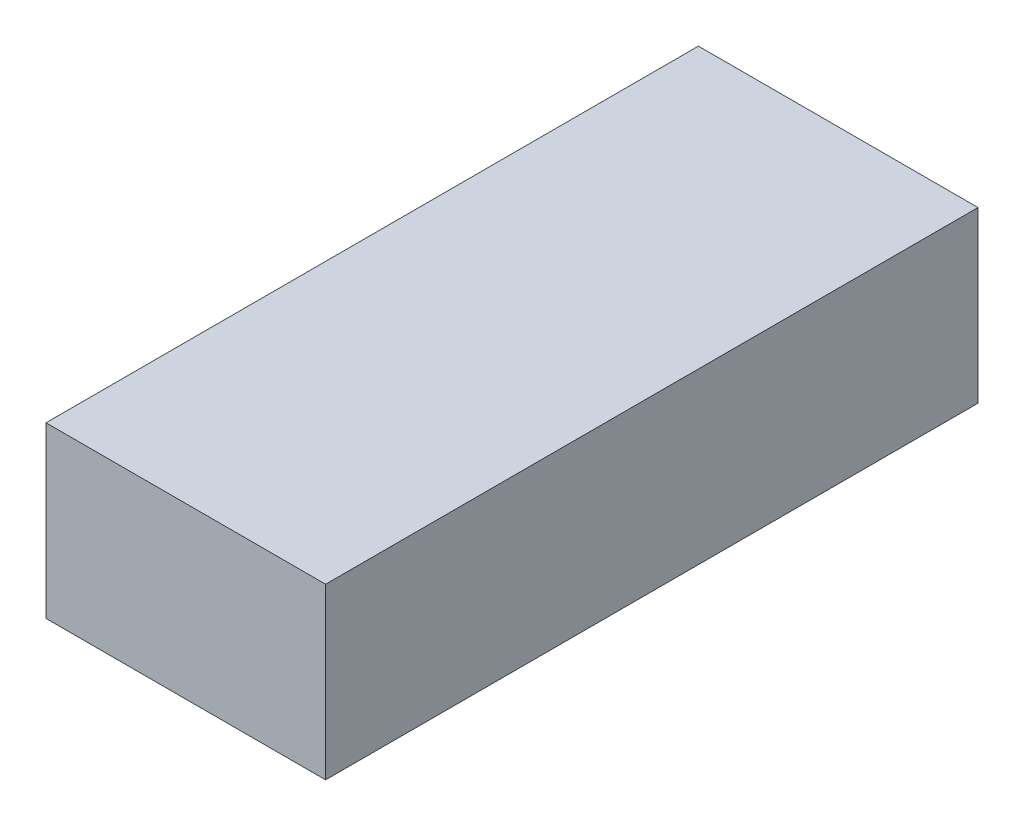
ISO-10303-21;
HEADER;
FILE_DESCRIPTION(('STEP AP214'),'2;1');
FILE_NAME('part.step','',(''),(''),'','','');
FILE_SCHEMA(('AUTOMOTIVE_DESIGN { 1 0 10303 214 1 1 1 1 }'));
ENDSEC;
DATA;
#1=APPLICATION_CONTEXT('core data for automotive mechanical design processes');
#2=APPLICATION_PROTOCOL_DEFINITION('international standard','automotive_design',2000,#1);
#3=PRODUCT_CONTEXT('',#1,'mechanical');
#4=PRODUCT('Part','Part','',(#3));
#5=PRODUCT_RELATED_PRODUCT_CATEGORY('part','',(#4));
#6=PRODUCT_DEFINITION_FORMATION('','',#4);
#7=PRODUCT_DEFINITION_CONTEXT('part definition',#1,'design');
#8=PRODUCT_DEFINITION('design','',#6,#7);
#9=PRODUCT_DEFINITION_SHAPE('','',#8);
#10=(LENGTH_UNIT() NAMED_UNIT(*) SI_UNIT(.MILLI.,.METRE.));
#11=(NAMED_UNIT(*) PLANE_ANGLE_UNIT() SI_UNIT($,.RADIAN.));
#12=(NAMED_UNIT(*) SI_UNIT($,.STERADIAN.) SOLID_ANGLE_UNIT());
#13=UNCERTAINTY_MEASURE_WITH_UNIT(LENGTH_MEASURE(1.E-05),#10,'distance_accuracy_value','');
#14=(GEOMETRIC_REPRESENTATION_CONTEXT(3) GLOBAL_UNCERTAINTY_ASSIGNED_CONTEXT((#13)) GLOBAL_UNIT_ASSIGNED_CONTEXT((#10,
#11,#12)) REPRESENTATION_CONTEXT('',''));
#15=CARTESIAN_POINT('',(0.,0.,0.));
#16=DIRECTION('',(0.,0.,1.));
#17=DIRECTION('',(1.,0.,0.));
#18=AXIS2_PLACEMENT_3D('',#15,#16,#17);
#19=CARTESIAN_POINT('',(16.5,20.,38.5));
#20=DIRECTION('',(-1.,0.,0.));
#21=DIRECTION('',(0.,0.,1.));
#22=AXIS2_PLACEMENT_3D('',#19,#20,#21);
#23=PLANE('',#22);
#24=DIRECTION('',(0.,0.,-1.));
#25=VECTOR('',#24,1.);
#26=CARTESIAN_POINT('',(16.5,0.,38.5));
#27=LINE('',#26,#25);
#28=CARTESIAN_POINT('',(16.5,0.,38.5));
#29=VERTEX_POINT('',#28);
#30=CARTESIAN_POINT('',(16.5,0.,-38.5));
#31=VERTEX_POINT('',#30);
#32=EDGE_CURVE('E97',#29,#31,#27,.T.);
#33=ORIENTED_EDGE('',*,*,#32,.T.);
#34=DIRECTION('',(0.,-1.,0.));
#35=VECTOR('',#34,1.);
#36=CARTESIAN_POINT('',(16.5,20.,-38.5));
#37=LINE('',#36,#35);
#38=CARTESIAN_POINT('',(16.5,20.,-38.5));
#39=VERTEX_POINT('',#38);
#40=EDGE_CURVE('E11',#39,#31,#37,.T.);
#41=ORIENTED_EDGE('',*,*,#40,.F.);
#42=DIRECTION('',(0.,0.,-1.));
#43=VECTOR('',#42,1.);
#44=CARTESIAN_POINT('',(16.5,20.,38.5));
#45=LINE('',#44,#43);
#46=CARTESIAN_POINT('',(16.5,20.,38.5));
#47=VERTEX_POINT('',#46);
#48=EDGE_CURVE('E85',#47,#39,#45,.T.);
#49=ORIENTED_EDGE('',*,*,#48,.F.);
#50=DIRECTION('',(0.,-1.,0.));
#51=VECTOR('',#50,1.);
#52=CARTESIAN_POINT('',(16.5,20.,38.5));
#53=LINE('',#52,#51);
#54=EDGE_CURVE('E93',#47,#29,#53,.T.);
#55=ORIENTED_EDGE('',*,*,#54,.T.);
#56=EDGE_LOOP('',(#33,#41,#49,#55));
#57=FACE_BOUND('',#56,.T.);
#58=ADVANCED_FACE('F34',(#57),#23,.F.);
#59=CARTESIAN_POINT('',(16.5,20.,-38.5));
#60=DIRECTION('',(0.,0.,1.));
#61=DIRECTION('',(1.,0.,0.));
#62=AXIS2_PLACEMENT_3D('',#59,#60,#61);
#63=PLANE('',#62);
#64=DIRECTION('',(-1.,0.,0.));
#65=VECTOR('',#64,1.);
#66=CARTESIAN_POINT('',(16.5,0.,-38.5));
#67=LINE('',#66,#65);
#68=CARTESIAN_POINT('',(-16.5,0.,-38.5));
#69=VERTEX_POINT('',#68);
#70=EDGE_CURVE('E89',#31,#69,#67,.T.);
#71=ORIENTED_EDGE('',*,*,#70,.T.);
#72=DIRECTION('',(0.,-1.,0.));
#73=VECTOR('',#72,1.);
#74=CARTESIAN_POINT('',(-16.5,20.,-38.5));
#75=LINE('',#74,#73);
#76=CARTESIAN_POINT('',(-16.5,20.,-38.5));
#77=VERTEX_POINT('',#76);
#78=EDGE_CURVE('E42',#77,#69,#75,.T.);
#79=ORIENTED_EDGE('',*,*,#78,.F.);
#80=DIRECTION('',(-1.,0.,0.));
#81=VECTOR('',#80,1.);
#82=CARTESIAN_POINT('',(16.5,20.,-38.5));
#83=LINE('',#82,#81);
#84=EDGE_CURVE('E80',#39,#77,#83,.T.);
#85=ORIENTED_EDGE('',*,*,#84,.F.);
#86=ORIENTED_EDGE('',*,*,#40,.T.);
#87=EDGE_LOOP('',(#71,#79,#85,#86));
#88=FACE_BOUND('',#87,.T.);
#89=ADVANCED_FACE('F88',(#88),#63,.F.);
#90=CARTESIAN_POINT('',(-16.5,20.,38.5));
#91=DIRECTION('',(1.,0.,0.));
#92=DIRECTION('',(0.,0.,-1.));
#93=AXIS2_PLACEMENT_3D('',#90,#91,#92);
#94=PLANE('',#93);
#95=DIRECTION('',(0.,0.,1.));
#96=VECTOR('',#95,1.);
#97=CARTESIAN_POINT('',(-16.5,0.,38.5));
#98=LINE('',#97,#96);
#99=CARTESIAN_POINT('',(-16.5,0.,38.5));
#100=VERTEX_POINT('',#99);
#101=EDGE_CURVE('E67',#69,#100,#98,.T.);
#102=ORIENTED_EDGE('',*,*,#101,.T.);
#103=DIRECTION('',(0.,-1.,0.));
#104=VECTOR('',#103,1.);
#105=CARTESIAN_POINT('',(-16.5,20.,38.5));
#106=LINE('',#105,#104);
#107=CARTESIAN_POINT('',(-16.5,20.,38.5));
#108=VERTEX_POINT('',#107);
#109=EDGE_CURVE('E90',#108,#100,#106,.T.);
#110=ORIENTED_EDGE('',*,*,#109,.F.);
#111=DIRECTION('',(0.,0.,1.));
#112=VECTOR('',#111,1.);
#113=CARTESIAN_POINT('',(-16.5,20.,38.5));
#114=LINE('',#113,#112);
#115=EDGE_CURVE('E83',#77,#108,#114,.T.);
#116=ORIENTED_EDGE('',*,*,#115,.F.);
#117=ORIENTED_EDGE('',*,*,#78,.T.);
#118=EDGE_LOOP('',(#102,#110,#116,#117));
#119=FACE_BOUND('',#118,.T.);
#120=ADVANCED_FACE('F91',(#119),#94,.F.);
#121=CARTESIAN_POINT('',(16.5,20.,38.5));
#122=DIRECTION('',(0.,0.,-1.));
#123=DIRECTION('',(-1.,0.,0.));
#124=AXIS2_PLACEMENT_3D('',#121,#122,#123);
#125=PLANE('',#124);
#126=DIRECTION('',(1.,0.,0.));
#127=VECTOR('',#126,1.);
#128=CARTESIAN_POINT('',(16.5,0.,38.5));
#129=LINE('',#128,#127);
#130=EDGE_CURVE('E73',#100,#29,#129,.T.);
#131=ORIENTED_EDGE('',*,*,#130,.T.);
#132=ORIENTED_EDGE('',*,*,#54,.F.);
#133=DIRECTION('',(1.,0.,0.));
#134=VECTOR('',#133,1.);
#135=CARTESIAN_POINT('',(16.5,20.,38.5));
#136=LINE('',#135,#134);
#137=EDGE_CURVE('E50',#108,#47,#136,.T.);
#138=ORIENTED_EDGE('',*,*,#137,.F.);
#139=ORIENTED_EDGE('',*,*,#109,.T.);
#140=EDGE_LOOP('',(#131,#132,#138,#139));
#141=FACE_BOUND('',#140,.T.);
#142=ADVANCED_FACE('F104',(#141),#125,.F.);
#143=CARTESIAN_POINT('',(0.,20.,0.));
#144=DIRECTION('',(0.,1.,0.));
#145=DIRECTION('',(0.,0.,1.));
#146=AXIS2_PLACEMENT_3D('',#143,#144,#145);
#147=PLANE('',#146);
#148=ORIENTED_EDGE('',*,*,#48,.T.);
#149=ORIENTED_EDGE('',*,*,#84,.T.);
#150=ORIENTED_EDGE('',*,*,#115,.T.);
#151=ORIENTED_EDGE('',*,*,#137,.T.);
#152=EDGE_LOOP('',(#148,#149,#150,#151));
#153=FACE_BOUND('',#152,.T.);
#154=ADVANCED_FACE('F81',(#153),#147,.T.);
#155=CARTESIAN_POINT('',(0.,0.,0.));
#156=DIRECTION('',(0.,1.,0.));
#157=DIRECTION('',(0.,0.,1.));
#158=AXIS2_PLACEMENT_3D('',#155,#156,#157);
#159=PLANE('',#158);
#160=ORIENTED_EDGE('',*,*,#32,.F.);
#161=ORIENTED_EDGE('',*,*,#130,.F.);
#162=ORIENTED_EDGE('',*,*,#101,.F.);
#163=ORIENTED_EDGE('',*,*,#70,.F.);
#164=EDGE_LOOP('',(#160,#161,#162,#163));
#165=FACE_BOUND('',#164,.T.);
#166=ADVANCED_FACE('F107',(#165),#159,.F.);
#167=CLOSED_SHELL('',(#58,#89,#120,#142,#154,#166));
#168=MANIFOLD_SOLID_BREP('B2',#167);
#169=ADVANCED_BREP_SHAPE_REPRESENTATION('',(#18,#168),#14);
#170=SHAPE_DEFINITION_REPRESENTATION(#9,#169);
ENDSEC;
END-ISO-10303-21;
